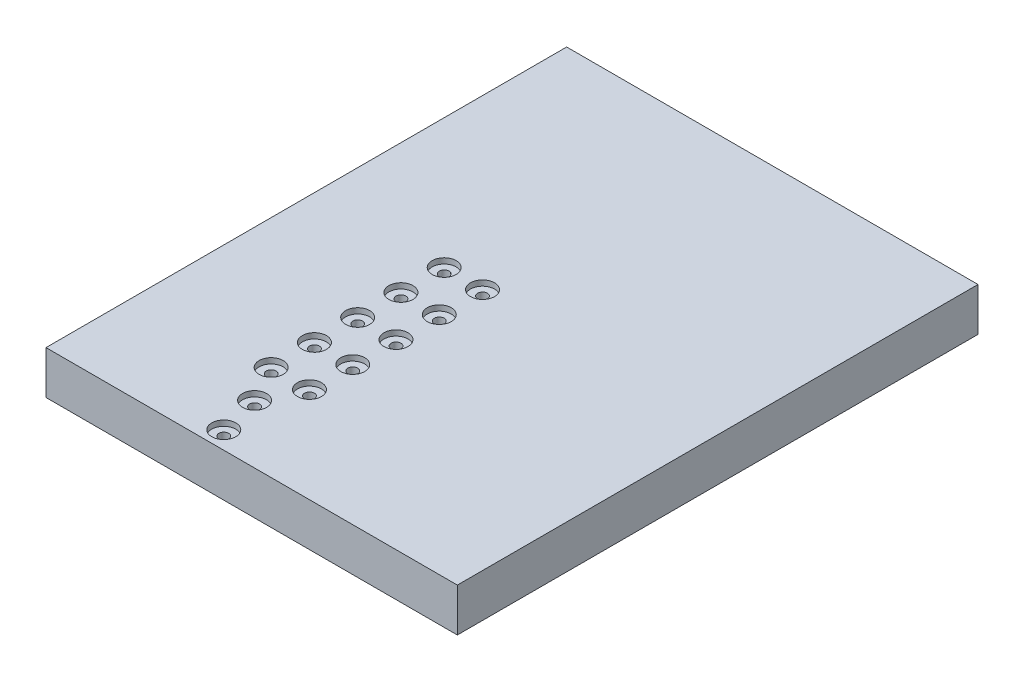
ISO-10303-21;
HEADER;
FILE_DESCRIPTION(('STEP AP214'),'2;1');
FILE_NAME('part.step','',(''),(''),'','','');
FILE_SCHEMA(('AUTOMOTIVE_DESIGN { 1 0 10303 214 1 1 1 1 }'));
ENDSEC;
DATA;
#1=APPLICATION_CONTEXT('core data for automotive mechanical design processes');
#2=APPLICATION_PROTOCOL_DEFINITION('international standard','automotive_design',2000,#1);
#3=PRODUCT_CONTEXT('',#1,'mechanical');
#4=PRODUCT('Part','Part','',(#3));
#5=PRODUCT_RELATED_PRODUCT_CATEGORY('part','',(#4));
#6=PRODUCT_DEFINITION_FORMATION('','',#4);
#7=PRODUCT_DEFINITION_CONTEXT('part definition',#1,'design');
#8=PRODUCT_DEFINITION('design','',#6,#7);
#9=PRODUCT_DEFINITION_SHAPE('','',#8);
#10=(LENGTH_UNIT() NAMED_UNIT(*) SI_UNIT(.MILLI.,.METRE.));
#11=(NAMED_UNIT(*) PLANE_ANGLE_UNIT() SI_UNIT($,.RADIAN.));
#12=(NAMED_UNIT(*) SI_UNIT($,.STERADIAN.) SOLID_ANGLE_UNIT());
#13=UNCERTAINTY_MEASURE_WITH_UNIT(LENGTH_MEASURE(1.E-05),#10,'distance_accuracy_value','');
#14=(GEOMETRIC_REPRESENTATION_CONTEXT(3) GLOBAL_UNCERTAINTY_ASSIGNED_CONTEXT((#13)) GLOBAL_UNIT_ASSIGNED_CONTEXT((#10,
#11,#12)) REPRESENTATION_CONTEXT('',''));
#15=CARTESIAN_POINT('',(0.,0.,0.));
#16=DIRECTION('',(0.,0.,1.));
#17=DIRECTION('',(1.,0.,0.));
#18=AXIS2_PLACEMENT_3D('',#15,#16,#17);
#19=CARTESIAN_POINT('',(-4.42996892579231,10.,21.8648993809643));
#20=DIRECTION('',(0.,1.,0.));
#21=DIRECTION('',(0.,0.,1.));
#22=AXIS2_PLACEMENT_3D('',#19,#20,#21);
#23=CYLINDRICAL_SURFACE('',#22,2.77876);
#24=CARTESIAN_POINT('',(-4.42996892579231,8.73,21.8648993809643));
#25=DIRECTION('',(0.,1.,0.));
#26=DIRECTION('',(0.,0.,1.));
#27=AXIS2_PLACEMENT_3D('',#24,#25,#26);
#28=CIRCLE('',#27,2.77876);
#29=CARTESIAN_POINT('',(-4.42996892579231,8.73,24.6436593809643));
#30=VERTEX_POINT('',#29);
#31=EDGE_CURVE('E11',#30,#30,#28,.T.);
#32=ORIENTED_EDGE('',*,*,#31,.F.);
#33=EDGE_LOOP('',(#32));
#34=FACE_BOUND('',#33,.T.);
#35=CARTESIAN_POINT('',(-4.42996892579231,10.,21.8648993809643));
#36=DIRECTION('',(0.,1.,0.));
#37=DIRECTION('',(0.,0.,1.));
#38=AXIS2_PLACEMENT_3D('',#35,#36,#37);
#39=CIRCLE('',#38,2.77875999999999);
#40=CARTESIAN_POINT('',(-4.42996892579231,10.,24.6436593809643));
#41=VERTEX_POINT('',#40);
#42=EDGE_CURVE('E268',#41,#41,#39,.T.);
#43=ORIENTED_EDGE('',*,*,#42,.T.);
#44=EDGE_LOOP('',(#43));
#45=FACE_BOUND('',#44,.T.);
#46=ADVANCED_FACE('F33',(#34,#45),#23,.F.);
#47=CARTESIAN_POINT('',(-3.29966892579231,8.73,21.8648993809643));
#48=DIRECTION('',(0.,-1.,0.));
#49=DIRECTION('',(0.,0.,-1.));
#50=AXIS2_PLACEMENT_3D('',#47,#48,#49);
#51=PLANE('',#50);
#52=CARTESIAN_POINT('',(-4.42996892579231,8.73,21.8648993809643));
#53=DIRECTION('',(0.,1.,0.));
#54=DIRECTION('',(0.,0.,1.));
#55=AXIS2_PLACEMENT_3D('',#52,#53,#54);
#56=CIRCLE('',#55,1.1303);
#57=CARTESIAN_POINT('',(-4.42996892579231,8.73,22.9951993809643));
#58=VERTEX_POINT('',#57);
#59=EDGE_CURVE('E40',#58,#58,#56,.T.);
#60=ORIENTED_EDGE('',*,*,#59,.F.);
#61=EDGE_LOOP('',(#60));
#62=FACE_BOUND('',#61,.T.);
#63=ORIENTED_EDGE('',*,*,#31,.T.);
#64=EDGE_LOOP('',(#63));
#65=FACE_BOUND('',#64,.T.);
#66=ADVANCED_FACE('F278',(#62,#65),#51,.F.);
#67=CARTESIAN_POINT('',(-4.42996892579231,10.,21.8648993809643));
#68=DIRECTION('',(0.,1.,0.));
#69=DIRECTION('',(0.,0.,1.));
#70=AXIS2_PLACEMENT_3D('',#67,#68,#69);
#71=CYLINDRICAL_SURFACE('',#70,1.1303);
#72=CARTESIAN_POINT('',(-4.42996892579231,7.,21.8648993809643));
#73=DIRECTION('',(0.,1.,0.));
#74=DIRECTION('',(0.,0.,1.));
#75=AXIS2_PLACEMENT_3D('',#72,#73,#74);
#76=CIRCLE('',#75,1.1303);
#77=CARTESIAN_POINT('',(-4.42996892579231,7.,22.9951993809643));
#78=VERTEX_POINT('',#77);
#79=EDGE_CURVE('E271',#78,#78,#76,.T.);
#80=ORIENTED_EDGE('',*,*,#79,.F.);
#81=EDGE_LOOP('',(#80));
#82=FACE_BOUND('',#81,.T.);
#83=ORIENTED_EDGE('',*,*,#59,.T.);
#84=EDGE_LOOP('',(#83));
#85=FACE_BOUND('',#84,.T.);
#86=ADVANCED_FACE('F276',(#82,#85),#71,.F.);
#87=CARTESIAN_POINT('',(-4.42996892579231,7.,21.8648993809643));
#88=DIRECTION('',(0.,1.,0.));
#89=DIRECTION('',(0.,0.,1.));
#90=AXIS2_PLACEMENT_3D('',#87,#88,#89);
#91=CONICAL_SURFACE('',#90,1.1303,1.02974425867665);
#92=CARTESIAN_POINT('',(-4.42996892579231,6.32084724231315,21.8648993809643));
#93=VERTEX_POINT('',#92);
#94=VERTEX_LOOP('',#93);
#95=FACE_BOUND('',#94,.T.);
#96=ORIENTED_EDGE('',*,*,#79,.T.);
#97=EDGE_LOOP('',(#96));
#98=FACE_BOUND('',#97,.T.);
#99=ADVANCED_FACE('F349',(#95,#98),#91,.F.);
#100=CARTESIAN_POINT('',(-4.42996892579231,10.,31.8648993809643));
#101=DIRECTION('',(0.,1.,0.));
#102=DIRECTION('',(0.,0.,1.));
#103=AXIS2_PLACEMENT_3D('',#100,#101,#102);
#104=CYLINDRICAL_SURFACE('',#103,2.77876);
#105=CARTESIAN_POINT('',(-4.42996892579231,8.73,31.8648993809643));
#106=DIRECTION('',(0.,1.,0.));
#107=DIRECTION('',(0.,0.,1.));
#108=AXIS2_PLACEMENT_3D('',#105,#106,#107);
#109=CIRCLE('',#108,2.77876);
#110=CARTESIAN_POINT('',(-4.42996892579231,8.73,34.6436593809643));
#111=VERTEX_POINT('',#110);
#112=EDGE_CURVE('E265',#111,#111,#109,.T.);
#113=ORIENTED_EDGE('',*,*,#112,.F.);
#114=EDGE_LOOP('',(#113));
#115=FACE_BOUND('',#114,.T.);
#116=CARTESIAN_POINT('',(-4.42996892579231,10.,31.8648993809643));
#117=DIRECTION('',(0.,1.,0.));
#118=DIRECTION('',(0.,0.,1.));
#119=AXIS2_PLACEMENT_3D('',#116,#117,#118);
#120=CIRCLE('',#119,2.77875999999999);
#121=CARTESIAN_POINT('',(-4.42996892579231,10.,34.6436593809643));
#122=VERTEX_POINT('',#121);
#123=EDGE_CURVE('E256',#122,#122,#120,.T.);
#124=ORIENTED_EDGE('',*,*,#123,.T.);
#125=EDGE_LOOP('',(#124));
#126=FACE_BOUND('',#125,.T.);
#127=ADVANCED_FACE('F345',(#115,#126),#104,.F.);
#128=CARTESIAN_POINT('',(-3.29966892579231,8.73,31.8648993809643));
#129=DIRECTION('',(0.,-1.,0.));
#130=DIRECTION('',(0.,0.,-1.));
#131=AXIS2_PLACEMENT_3D('',#128,#129,#130);
#132=PLANE('',#131);
#133=CARTESIAN_POINT('',(-4.42996892579231,8.73,31.8648993809643));
#134=DIRECTION('',(0.,1.,0.));
#135=DIRECTION('',(0.,0.,1.));
#136=AXIS2_PLACEMENT_3D('',#133,#134,#135);
#137=CIRCLE('',#136,1.1303);
#138=CARTESIAN_POINT('',(-4.42996892579231,8.73,32.9951993809643));
#139=VERTEX_POINT('',#138);
#140=EDGE_CURVE('E262',#139,#139,#137,.T.);
#141=ORIENTED_EDGE('',*,*,#140,.F.);
#142=EDGE_LOOP('',(#141));
#143=FACE_BOUND('',#142,.T.);
#144=ORIENTED_EDGE('',*,*,#112,.T.);
#145=EDGE_LOOP('',(#144));
#146=FACE_BOUND('',#145,.T.);
#147=ADVANCED_FACE('F341',(#143,#146),#132,.F.);
#148=CARTESIAN_POINT('',(-4.42996892579231,10.,31.8648993809643));
#149=DIRECTION('',(0.,1.,0.));
#150=DIRECTION('',(0.,0.,1.));
#151=AXIS2_PLACEMENT_3D('',#148,#149,#150);
#152=CYLINDRICAL_SURFACE('',#151,1.1303);
#153=CARTESIAN_POINT('',(-4.42996892579231,7.,31.8648993809643));
#154=DIRECTION('',(0.,1.,0.));
#155=DIRECTION('',(0.,0.,1.));
#156=AXIS2_PLACEMENT_3D('',#153,#154,#155);
#157=CIRCLE('',#156,1.1303);
#158=CARTESIAN_POINT('',(-4.42996892579231,7.,32.9951993809643));
#159=VERTEX_POINT('',#158);
#160=EDGE_CURVE('E259',#159,#159,#157,.T.);
#161=ORIENTED_EDGE('',*,*,#160,.F.);
#162=EDGE_LOOP('',(#161));
#163=FACE_BOUND('',#162,.T.);
#164=ORIENTED_EDGE('',*,*,#140,.T.);
#165=EDGE_LOOP('',(#164));
#166=FACE_BOUND('',#165,.T.);
#167=ADVANCED_FACE('F338',(#163,#166),#152,.F.);
#168=CARTESIAN_POINT('',(-4.42996892579231,7.,31.8648993809643));
#169=DIRECTION('',(0.,1.,0.));
#170=DIRECTION('',(0.,0.,1.));
#171=AXIS2_PLACEMENT_3D('',#168,#169,#170);
#172=CONICAL_SURFACE('',#171,1.1303,1.02974425867665);
#173=CARTESIAN_POINT('',(-4.42996892579231,6.32084724231315,31.8648993809643));
#174=VERTEX_POINT('',#173);
#175=VERTEX_LOOP('',#174);
#176=FACE_BOUND('',#175,.T.);
#177=ORIENTED_EDGE('',*,*,#160,.T.);
#178=EDGE_LOOP('',(#177));
#179=FACE_BOUND('',#178,.T.);
#180=ADVANCED_FACE('F334',(#176,#179),#172,.F.);
#181=CARTESIAN_POINT('',(-4.42996892579231,10.,41.8648993809643));
#182=DIRECTION('',(0.,1.,0.));
#183=DIRECTION('',(0.,0.,1.));
#184=AXIS2_PLACEMENT_3D('',#181,#182,#183);
#185=CYLINDRICAL_SURFACE('',#184,2.77876);
#186=CARTESIAN_POINT('',(-4.42996892579231,8.73,41.8648993809643));
#187=DIRECTION('',(0.,1.,0.));
#188=DIRECTION('',(0.,0.,1.));
#189=AXIS2_PLACEMENT_3D('',#186,#187,#188);
#190=CIRCLE('',#189,2.77876);
#191=CARTESIAN_POINT('',(-4.42996892579231,8.73,44.6436593809643));
#192=VERTEX_POINT('',#191);
#193=EDGE_CURVE('E253',#192,#192,#190,.T.);
#194=ORIENTED_EDGE('',*,*,#193,.F.);
#195=EDGE_LOOP('',(#194));
#196=FACE_BOUND('',#195,.T.);
#197=CARTESIAN_POINT('',(-4.42996892579231,10.,41.8648993809643));
#198=DIRECTION('',(0.,1.,0.));
#199=DIRECTION('',(0.,0.,1.));
#200=AXIS2_PLACEMENT_3D('',#197,#198,#199);
#201=CIRCLE('',#200,2.77875999999999);
#202=CARTESIAN_POINT('',(-4.42996892579231,10.,44.6436593809643));
#203=VERTEX_POINT('',#202);
#204=EDGE_CURVE('E244',#203,#203,#201,.T.);
#205=ORIENTED_EDGE('',*,*,#204,.T.);
#206=EDGE_LOOP('',(#205));
#207=FACE_BOUND('',#206,.T.);
#208=ADVANCED_FACE('F330',(#196,#207),#185,.F.);
#209=CARTESIAN_POINT('',(-3.29966892579231,8.73,41.8648993809643));
#210=DIRECTION('',(0.,-1.,0.));
#211=DIRECTION('',(0.,0.,-1.));
#212=AXIS2_PLACEMENT_3D('',#209,#210,#211);
#213=PLANE('',#212);
#214=CARTESIAN_POINT('',(-4.42996892579231,8.73,41.8648993809643));
#215=DIRECTION('',(0.,1.,0.));
#216=DIRECTION('',(0.,0.,1.));
#217=AXIS2_PLACEMENT_3D('',#214,#215,#216);
#218=CIRCLE('',#217,1.1303);
#219=CARTESIAN_POINT('',(-4.42996892579231,8.73,42.9951993809643));
#220=VERTEX_POINT('',#219);
#221=EDGE_CURVE('E250',#220,#220,#218,.T.);
#222=ORIENTED_EDGE('',*,*,#221,.F.);
#223=EDGE_LOOP('',(#222));
#224=FACE_BOUND('',#223,.T.);
#225=ORIENTED_EDGE('',*,*,#193,.T.);
#226=EDGE_LOOP('',(#225));
#227=FACE_BOUND('',#226,.T.);
#228=ADVANCED_FACE('F326',(#224,#227),#213,.F.);
#229=CARTESIAN_POINT('',(-4.42996892579231,10.,41.8648993809643));
#230=DIRECTION('',(0.,1.,0.));
#231=DIRECTION('',(0.,0.,1.));
#232=AXIS2_PLACEMENT_3D('',#229,#230,#231);
#233=CYLINDRICAL_SURFACE('',#232,1.1303);
#234=CARTESIAN_POINT('',(-4.42996892579231,7.,41.8648993809643));
#235=DIRECTION('',(0.,1.,0.));
#236=DIRECTION('',(0.,0.,1.));
#237=AXIS2_PLACEMENT_3D('',#234,#235,#236);
#238=CIRCLE('',#237,1.1303);
#239=CARTESIAN_POINT('',(-4.42996892579231,7.,42.9951993809643));
#240=VERTEX_POINT('',#239);
#241=EDGE_CURVE('E247',#240,#240,#238,.T.);
#242=ORIENTED_EDGE('',*,*,#241,.F.);
#243=EDGE_LOOP('',(#242));
#244=FACE_BOUND('',#243,.T.);
#245=ORIENTED_EDGE('',*,*,#221,.T.);
#246=EDGE_LOOP('',(#245));
#247=FACE_BOUND('',#246,.T.);
#248=ADVANCED_FACE('F322',(#244,#247),#233,.F.);
#249=CARTESIAN_POINT('',(-4.42996892579231,7.,41.8648993809643));
#250=DIRECTION('',(0.,1.,0.));
#251=DIRECTION('',(0.,0.,1.));
#252=AXIS2_PLACEMENT_3D('',#249,#250,#251);
#253=CONICAL_SURFACE('',#252,1.1303,1.02974425867665);
#254=CARTESIAN_POINT('',(-4.42996892579231,6.32084724231315,41.8648993809643));
#255=VERTEX_POINT('',#254);
#256=VERTEX_LOOP('',#255);
#257=FACE_BOUND('',#256,.T.);
#258=ORIENTED_EDGE('',*,*,#241,.T.);
#259=EDGE_LOOP('',(#258));
#260=FACE_BOUND('',#259,.T.);
#261=ADVANCED_FACE('F318',(#257,#260),#253,.F.);
#262=CARTESIAN_POINT('',(-34.4299689257923,10.,-36.441967666633));
#263=DIRECTION('',(1.,0.,0.));
#264=DIRECTION('',(0.,0.,-1.));
#265=AXIS2_PLACEMENT_3D('',#262,#263,#264);
#266=PLANE('',#265);
#267=DIRECTION('',(0.,0.,1.));
#268=VECTOR('',#267,1.);
#269=CARTESIAN_POINT('',(-34.4299689257923,0.,-36.441967666633));
#270=LINE('',#269,#268);
#271=CARTESIAN_POINT('',(-34.4299689257923,0.,-36.441967666633));
#272=VERTEX_POINT('',#271);
#273=CARTESIAN_POINT('',(-34.4299689257923,0.,83.9112685961254));
#274=VERTEX_POINT('',#273);
#275=EDGE_CURVE('E214',#272,#274,#270,.T.);
#276=ORIENTED_EDGE('',*,*,#275,.T.);
#277=DIRECTION('',(0.,-1.,0.));
#278=VECTOR('',#277,1.);
#279=CARTESIAN_POINT('',(-34.4299689257923,10.,83.9112685961254));
#280=LINE('',#279,#278);
#281=CARTESIAN_POINT('',(-34.4299689257923,10.,83.9112685961254));
#282=VERTEX_POINT('',#281);
#283=EDGE_CURVE('E241',#282,#274,#280,.T.);
#284=ORIENTED_EDGE('',*,*,#283,.F.);
#285=DIRECTION('',(0.,0.,1.));
#286=VECTOR('',#285,1.);
#287=CARTESIAN_POINT('',(-34.4299689257923,10.,-36.441967666633));
#288=LINE('',#287,#286);
#289=CARTESIAN_POINT('',(-34.4299689257923,10.,-36.441967666633));
#290=VERTEX_POINT('',#289);
#291=EDGE_CURVE('E215',#290,#282,#288,.T.);
#292=ORIENTED_EDGE('',*,*,#291,.F.);
#293=DIRECTION('',(0.,-1.,0.));
#294=VECTOR('',#293,1.);
#295=CARTESIAN_POINT('',(-34.4299689257923,10.,-36.441967666633));
#296=LINE('',#295,#294);
#297=EDGE_CURVE('E225',#290,#272,#296,.T.);
#298=ORIENTED_EDGE('',*,*,#297,.T.);
#299=EDGE_LOOP('',(#276,#284,#292,#298));
#300=FACE_BOUND('',#299,.T.);
#301=ADVANCED_FACE('F314',(#300),#266,.F.);
#302=CARTESIAN_POINT('',(-34.4299689257923,10.,83.9112685961254));
#303=DIRECTION('',(0.,0.,-1.));
#304=DIRECTION('',(-1.,0.,0.));
#305=AXIS2_PLACEMENT_3D('',#302,#303,#304);
#306=PLANE('',#305);
#307=DIRECTION('',(1.,0.,0.));
#308=VECTOR('',#307,1.);
#309=CARTESIAN_POINT('',(-34.4299689257923,0.,83.9112685961254));
#310=LINE('',#309,#308);
#311=CARTESIAN_POINT('',(60.6545776224721,0.,83.9112685961254));
#312=VERTEX_POINT('',#311);
#313=EDGE_CURVE('E228',#274,#312,#310,.T.);
#314=ORIENTED_EDGE('',*,*,#313,.T.);
#315=DIRECTION('',(0.,-1.,0.));
#316=VECTOR('',#315,1.);
#317=CARTESIAN_POINT('',(60.6545776224721,10.,83.9112685961254));
#318=LINE('',#317,#316);
#319=CARTESIAN_POINT('',(60.6545776224721,10.,83.9112685961254));
#320=VERTEX_POINT('',#319);
#321=EDGE_CURVE('E238',#320,#312,#318,.T.);
#322=ORIENTED_EDGE('',*,*,#321,.F.);
#323=DIRECTION('',(1.,0.,0.));
#324=VECTOR('',#323,1.);
#325=CARTESIAN_POINT('',(-34.4299689257923,10.,83.9112685961254));
#326=LINE('',#325,#324);
#327=EDGE_CURVE('E218',#282,#320,#326,.T.);
#328=ORIENTED_EDGE('',*,*,#327,.F.);
#329=ORIENTED_EDGE('',*,*,#283,.T.);
#330=EDGE_LOOP('',(#314,#322,#328,#329));
#331=FACE_BOUND('',#330,.T.);
#332=ADVANCED_FACE('F310',(#331),#306,.F.);
#333=CARTESIAN_POINT('',(60.6545776224721,10.,-36.441967666633));
#334=DIRECTION('',(-1.,0.,0.));
#335=DIRECTION('',(0.,0.,1.));
#336=AXIS2_PLACEMENT_3D('',#333,#334,#335);
#337=PLANE('',#336);
#338=DIRECTION('',(0.,0.,-1.));
#339=VECTOR('',#338,1.);
#340=CARTESIAN_POINT('',(60.6545776224721,0.,-36.441967666633));
#341=LINE('',#340,#339);
#342=CARTESIAN_POINT('',(60.6545776224721,0.,-36.441967666633));
#343=VERTEX_POINT('',#342);
#344=EDGE_CURVE('E230',#312,#343,#341,.T.);
#345=ORIENTED_EDGE('',*,*,#344,.T.);
#346=DIRECTION('',(0.,-1.,0.));
#347=VECTOR('',#346,1.);
#348=CARTESIAN_POINT('',(60.6545776224721,10.,-36.441967666633));
#349=LINE('',#348,#347);
#350=CARTESIAN_POINT('',(60.6545776224721,10.,-36.441967666633));
#351=VERTEX_POINT('',#350);
#352=EDGE_CURVE('E235',#351,#343,#349,.T.);
#353=ORIENTED_EDGE('',*,*,#352,.F.);
#354=DIRECTION('',(0.,0.,-1.));
#355=VECTOR('',#354,1.);
#356=CARTESIAN_POINT('',(60.6545776224721,10.,-36.441967666633));
#357=LINE('',#356,#355);
#358=EDGE_CURVE('E221',#320,#351,#357,.T.);
#359=ORIENTED_EDGE('',*,*,#358,.F.);
#360=ORIENTED_EDGE('',*,*,#321,.T.);
#361=EDGE_LOOP('',(#345,#353,#359,#360));
#362=FACE_BOUND('',#361,.T.);
#363=ADVANCED_FACE('F300',(#362),#337,.F.);
#364=CARTESIAN_POINT('',(-34.4299689257923,10.,-36.441967666633));
#365=DIRECTION('',(0.,0.,1.));
#366=DIRECTION('',(1.,0.,0.));
#367=AXIS2_PLACEMENT_3D('',#364,#365,#366);
#368=PLANE('',#367);
#369=DIRECTION('',(-1.,0.,0.));
#370=VECTOR('',#369,1.);
#371=CARTESIAN_POINT('',(-34.4299689257923,0.,-36.441967666633));
#372=LINE('',#371,#370);
#373=EDGE_CURVE('E219',#343,#272,#372,.T.);
#374=ORIENTED_EDGE('',*,*,#373,.T.);
#375=ORIENTED_EDGE('',*,*,#297,.F.);
#376=DIRECTION('',(-1.,0.,0.));
#377=VECTOR('',#376,1.);
#378=CARTESIAN_POINT('',(-34.4299689257923,10.,-36.441967666633));
#379=LINE('',#378,#377);
#380=EDGE_CURVE('E223',#351,#290,#379,.T.);
#381=ORIENTED_EDGE('',*,*,#380,.F.);
#382=ORIENTED_EDGE('',*,*,#352,.T.);
#383=EDGE_LOOP('',(#374,#375,#381,#382));
#384=FACE_BOUND('',#383,.T.);
#385=ADVANCED_FACE('F290',(#384),#368,.F.);
#386=CARTESIAN_POINT('',(0.,10.,0.));
#387=DIRECTION('',(0.,1.,0.));
#388=DIRECTION('',(0.,0.,1.));
#389=AXIS2_PLACEMENT_3D('',#386,#387,#388);
#390=PLANE('',#389);
#391=CARTESIAN_POINT('',(4.42996892579231,10.,21.8648993809643));
#392=DIRECTION('',(0.,1.,0.));
#393=DIRECTION('',(0.,0.,1.));
#394=AXIS2_PLACEMENT_3D('',#391,#392,#393);
#395=CIRCLE('',#394,2.77875999999999);
#396=CARTESIAN_POINT('',(4.42996892579231,10.,24.6436593809643));
#397=VERTEX_POINT('',#396);
#398=EDGE_CURVE('E808',#397,#397,#395,.T.);
#399=ORIENTED_EDGE('',*,*,#398,.F.);
#400=EDGE_LOOP('',(#399));
#401=FACE_BOUND('',#400,.T.);
#402=CARTESIAN_POINT('',(4.42996892579231,10.,31.8648993809643));
#403=DIRECTION('',(0.,1.,0.));
#404=DIRECTION('',(0.,0.,1.));
#405=AXIS2_PLACEMENT_3D('',#402,#403,#404);
#406=CIRCLE('',#405,2.77875999999999);
#407=CARTESIAN_POINT('',(4.42996892579231,10.,34.6436593809643));
#408=VERTEX_POINT('',#407);
#409=EDGE_CURVE('E111',#408,#408,#406,.T.);
#410=ORIENTED_EDGE('',*,*,#409,.F.);
#411=EDGE_LOOP('',(#410));
#412=FACE_BOUND('',#411,.T.);
#413=CARTESIAN_POINT('',(4.42996892579231,10.,41.8648993809643));
#414=DIRECTION('',(0.,1.,0.));
#415=DIRECTION('',(0.,0.,1.));
#416=AXIS2_PLACEMENT_3D('',#413,#414,#415);
#417=CIRCLE('',#416,2.77875999999999);
#418=CARTESIAN_POINT('',(4.42996892579231,10.,44.6436593809643));
#419=VERTEX_POINT('',#418);
#420=EDGE_CURVE('E130',#419,#419,#417,.T.);
#421=ORIENTED_EDGE('',*,*,#420,.F.);
#422=EDGE_LOOP('',(#421));
#423=FACE_BOUND('',#422,.T.);
#424=CARTESIAN_POINT('',(4.42996892579231,10.,51.8648993809643));
#425=DIRECTION('',(0.,1.,0.));
#426=DIRECTION('',(0.,0.,1.));
#427=AXIS2_PLACEMENT_3D('',#424,#425,#426);
#428=CIRCLE('',#427,2.77875999999999);
#429=CARTESIAN_POINT('',(4.42996892579231,10.,54.6436593809643));
#430=VERTEX_POINT('',#429);
#431=EDGE_CURVE('E142',#430,#430,#428,.T.);
#432=ORIENTED_EDGE('',*,*,#431,.F.);
#433=EDGE_LOOP('',(#432));
#434=FACE_BOUND('',#433,.T.);
#435=CARTESIAN_POINT('',(4.42996892579231,10.,61.8648993809643));
#436=DIRECTION('',(0.,1.,0.));
#437=DIRECTION('',(0.,0.,1.));
#438=AXIS2_PLACEMENT_3D('',#435,#436,#437);
#439=CIRCLE('',#438,2.77875999999999);
#440=CARTESIAN_POINT('',(4.42996892579231,10.,64.6436593809643));
#441=VERTEX_POINT('',#440);
#442=EDGE_CURVE('E154',#441,#441,#439,.T.);
#443=ORIENTED_EDGE('',*,*,#442,.F.);
#444=EDGE_LOOP('',(#443));
#445=FACE_BOUND('',#444,.T.);
#446=CARTESIAN_POINT('',(2.57397779532142,10.,79.8185527945847));
#447=DIRECTION('',(0.,1.,0.));
#448=DIRECTION('',(0.,0.,1.));
#449=AXIS2_PLACEMENT_3D('',#446,#447,#448);
#450=CIRCLE('',#449,2.77875999999999);
#451=CARTESIAN_POINT('',(2.57397779532142,10.,82.5973127945847));
#452=VERTEX_POINT('',#451);
#453=EDGE_CURVE('E166',#452,#452,#450,.T.);
#454=ORIENTED_EDGE('',*,*,#453,.F.);
#455=EDGE_LOOP('',(#454));
#456=FACE_BOUND('',#455,.T.);
#457=CARTESIAN_POINT('',(0.253826091125352,10.,70.3806825483727));
#458=DIRECTION('',(0.,1.,0.));
#459=DIRECTION('',(0.,0.,1.));
#460=AXIS2_PLACEMENT_3D('',#457,#458,#459);
#461=CIRCLE('',#460,2.77875999999999);
#462=CARTESIAN_POINT('',(0.253826091125352,10.,73.1594425483727));
#463=VERTEX_POINT('',#462);
#464=EDGE_CURVE('E178',#463,#463,#461,.T.);
#465=ORIENTED_EDGE('',*,*,#464,.F.);
#466=EDGE_LOOP('',(#465));
#467=FACE_BOUND('',#466,.T.);
#468=CARTESIAN_POINT('',(-4.42996892579231,10.,51.8648993809643));
#469=DIRECTION('',(0.,1.,0.));
#470=DIRECTION('',(0.,0.,1.));
#471=AXIS2_PLACEMENT_3D('',#468,#469,#470);
#472=CIRCLE('',#471,2.77875999999999);
#473=CARTESIAN_POINT('',(-4.42996892579231,10.,54.6436593809643));
#474=VERTEX_POINT('',#473);
#475=EDGE_CURVE('E190',#474,#474,#472,.T.);
#476=ORIENTED_EDGE('',*,*,#475,.F.);
#477=EDGE_LOOP('',(#476));
#478=FACE_BOUND('',#477,.T.);
#479=CARTESIAN_POINT('',(-4.42996892579231,10.,61.8648993809643));
#480=DIRECTION('',(0.,1.,0.));
#481=DIRECTION('',(0.,0.,1.));
#482=AXIS2_PLACEMENT_3D('',#479,#480,#481);
#483=CIRCLE('',#482,2.77875999999999);
#484=CARTESIAN_POINT('',(-4.42996892579231,10.,64.6436593809643));
#485=VERTEX_POINT('',#484);
#486=EDGE_CURVE('E202',#485,#485,#483,.T.);
#487=ORIENTED_EDGE('',*,*,#486,.F.);
#488=EDGE_LOOP('',(#487));
#489=FACE_BOUND('',#488,.T.);
#490=ORIENTED_EDGE('',*,*,#291,.T.);
#491=ORIENTED_EDGE('',*,*,#327,.T.);
#492=ORIENTED_EDGE('',*,*,#358,.T.);
#493=ORIENTED_EDGE('',*,*,#380,.T.);
#494=EDGE_LOOP('',(#490,#491,#492,#493));
#495=FACE_BOUND('',#494,.T.);
#496=ORIENTED_EDGE('',*,*,#204,.F.);
#497=EDGE_LOOP('',(#496));
#498=FACE_BOUND('',#497,.T.);
#499=ORIENTED_EDGE('',*,*,#123,.F.);
#500=EDGE_LOOP('',(#499));
#501=FACE_BOUND('',#500,.T.);
#502=ORIENTED_EDGE('',*,*,#42,.F.);
#503=EDGE_LOOP('',(#502));
#504=FACE_BOUND('',#503,.T.);
#505=ADVANCED_FACE('F287',(#401,#412,#423,#434,#445,#456,#467,#478,#489,#495,#498,#501,#504),
#390,.T.);
#506=CARTESIAN_POINT('',(0.,0.,0.));
#507=DIRECTION('',(0.,1.,0.));
#508=DIRECTION('',(0.,0.,1.));
#509=AXIS2_PLACEMENT_3D('',#506,#507,#508);
#510=PLANE('',#509);
#511=ORIENTED_EDGE('',*,*,#275,.F.);
#512=ORIENTED_EDGE('',*,*,#373,.F.);
#513=ORIENTED_EDGE('',*,*,#344,.F.);
#514=ORIENTED_EDGE('',*,*,#313,.F.);
#515=EDGE_LOOP('',(#511,#512,#513,#514));
#516=FACE_BOUND('',#515,.T.);
#517=ADVANCED_FACE('F289',(#516),#510,.F.);
#518=CARTESIAN_POINT('',(-4.42996892579231,7.,61.8648993809643));
#519=DIRECTION('',(0.,1.,0.));
#520=DIRECTION('',(0.,0.,1.));
#521=AXIS2_PLACEMENT_3D('',#518,#519,#520);
#522=CONICAL_SURFACE('',#521,1.1303,1.02974425867665);
#523=CARTESIAN_POINT('',(-4.42996892579231,6.32084724231315,61.8648993809643));
#524=VERTEX_POINT('',#523);
#525=VERTEX_LOOP('',#524);
#526=FACE_BOUND('',#525,.T.);
#527=CARTESIAN_POINT('',(-4.42996892579231,7.,61.8648993809643));
#528=DIRECTION('',(0.,1.,0.));
#529=DIRECTION('',(0.,0.,1.));
#530=AXIS2_PLACEMENT_3D('',#527,#528,#529);
#531=CIRCLE('',#530,1.1303);
#532=CARTESIAN_POINT('',(-4.42996892579231,7.,62.9951993809643));
#533=VERTEX_POINT('',#532);
#534=EDGE_CURVE('E211',#533,#533,#531,.T.);
#535=ORIENTED_EDGE('',*,*,#534,.T.);
#536=EDGE_LOOP('',(#535));
#537=FACE_BOUND('',#536,.T.);
#538=ADVANCED_FACE('F297',(#526,#537),#522,.F.);
#539=CARTESIAN_POINT('',(-4.42996892579231,10.,61.8648993809643));
#540=DIRECTION('',(0.,1.,0.));
#541=DIRECTION('',(0.,0.,1.));
#542=AXIS2_PLACEMENT_3D('',#539,#540,#541);
#543=CYLINDRICAL_SURFACE('',#542,1.1303);
#544=ORIENTED_EDGE('',*,*,#534,.F.);
#545=EDGE_LOOP('',(#544));
#546=FACE_BOUND('',#545,.T.);
#547=CARTESIAN_POINT('',(-4.42996892579231,8.73,61.8648993809643));
#548=DIRECTION('',(0.,1.,0.));
#549=DIRECTION('',(0.,0.,1.));
#550=AXIS2_PLACEMENT_3D('',#547,#548,#549);
#551=CIRCLE('',#550,1.1303);
#552=CARTESIAN_POINT('',(-4.42996892579231,8.73,62.9951993809643));
#553=VERTEX_POINT('',#552);
#554=EDGE_CURVE('E208',#553,#553,#551,.T.);
#555=ORIENTED_EDGE('',*,*,#554,.T.);
#556=EDGE_LOOP('',(#555));
#557=FACE_BOUND('',#556,.T.);
#558=ADVANCED_FACE('F430',(#546,#557),#543,.F.);
#559=CARTESIAN_POINT('',(-3.29966892579231,8.73,61.8648993809643));
#560=DIRECTION('',(0.,-1.,0.));
#561=DIRECTION('',(0.,0.,-1.));
#562=AXIS2_PLACEMENT_3D('',#559,#560,#561);
#563=PLANE('',#562);
#564=ORIENTED_EDGE('',*,*,#554,.F.);
#565=EDGE_LOOP('',(#564));
#566=FACE_BOUND('',#565,.T.);
#567=CARTESIAN_POINT('',(-4.42996892579231,8.73,61.8648993809643));
#568=DIRECTION('',(0.,1.,0.));
#569=DIRECTION('',(0.,0.,1.));
#570=AXIS2_PLACEMENT_3D('',#567,#568,#569);
#571=CIRCLE('',#570,2.77876);
#572=CARTESIAN_POINT('',(-4.42996892579231,8.73,64.6436593809643));
#573=VERTEX_POINT('',#572);
#574=EDGE_CURVE('E205',#573,#573,#571,.T.);
#575=ORIENTED_EDGE('',*,*,#574,.T.);
#576=EDGE_LOOP('',(#575));
#577=FACE_BOUND('',#576,.T.);
#578=ADVANCED_FACE('F439',(#566,#577),#563,.F.);
#579=CARTESIAN_POINT('',(-4.42996892579231,10.,61.8648993809643));
#580=DIRECTION('',(0.,1.,0.));
#581=DIRECTION('',(0.,0.,1.));
#582=AXIS2_PLACEMENT_3D('',#579,#580,#581);
#583=CYLINDRICAL_SURFACE('',#582,2.77876);
#584=ORIENTED_EDGE('',*,*,#574,.F.);
#585=EDGE_LOOP('',(#584));
#586=FACE_BOUND('',#585,.T.);
#587=ORIENTED_EDGE('',*,*,#486,.T.);
#588=EDGE_LOOP('',(#587));
#589=FACE_BOUND('',#588,.T.);
#590=ADVANCED_FACE('F448',(#586,#589),#583,.F.);
#591=CARTESIAN_POINT('',(-4.42996892579231,7.,51.8648993809643));
#592=DIRECTION('',(0.,1.,0.));
#593=DIRECTION('',(0.,0.,1.));
#594=AXIS2_PLACEMENT_3D('',#591,#592,#593);
#595=CONICAL_SURFACE('',#594,1.1303,1.02974425867665);
#596=CARTESIAN_POINT('',(-4.42996892579231,6.32084724231315,51.8648993809643));
#597=VERTEX_POINT('',#596);
#598=VERTEX_LOOP('',#597);
#599=FACE_BOUND('',#598,.T.);
#600=CARTESIAN_POINT('',(-4.42996892579231,7.,51.8648993809643));
#601=DIRECTION('',(0.,1.,0.));
#602=DIRECTION('',(0.,0.,1.));
#603=AXIS2_PLACEMENT_3D('',#600,#601,#602);
#604=CIRCLE('',#603,1.1303);
#605=CARTESIAN_POINT('',(-4.42996892579231,7.,52.9951993809643));
#606=VERTEX_POINT('',#605);
#607=EDGE_CURVE('E199',#606,#606,#604,.T.);
#608=ORIENTED_EDGE('',*,*,#607,.T.);
#609=EDGE_LOOP('',(#608));
#610=FACE_BOUND('',#609,.T.);
#611=ADVANCED_FACE('F458',(#599,#610),#595,.F.);
#612=CARTESIAN_POINT('',(-4.42996892579231,10.,51.8648993809643));
#613=DIRECTION('',(0.,1.,0.));
#614=DIRECTION('',(0.,0.,1.));
#615=AXIS2_PLACEMENT_3D('',#612,#613,#614);
#616=CYLINDRICAL_SURFACE('',#615,1.1303);
#617=ORIENTED_EDGE('',*,*,#607,.F.);
#618=EDGE_LOOP('',(#617));
#619=FACE_BOUND('',#618,.T.);
#620=CARTESIAN_POINT('',(-4.42996892579231,8.73,51.8648993809643));
#621=DIRECTION('',(0.,1.,0.));
#622=DIRECTION('',(0.,0.,1.));
#623=AXIS2_PLACEMENT_3D('',#620,#621,#622);
#624=CIRCLE('',#623,1.1303);
#625=CARTESIAN_POINT('',(-4.42996892579231,8.73,52.9951993809643));
#626=VERTEX_POINT('',#625);
#627=EDGE_CURVE('E196',#626,#626,#624,.T.);
#628=ORIENTED_EDGE('',*,*,#627,.T.);
#629=EDGE_LOOP('',(#628));
#630=FACE_BOUND('',#629,.T.);
#631=ADVANCED_FACE('F498',(#619,#630),#616,.F.);
#632=CARTESIAN_POINT('',(-3.29966892579231,8.73,51.8648993809643));
#633=DIRECTION('',(0.,-1.,0.));
#634=DIRECTION('',(0.,0.,-1.));
#635=AXIS2_PLACEMENT_3D('',#632,#633,#634);
#636=PLANE('',#635);
#637=ORIENTED_EDGE('',*,*,#627,.F.);
#638=EDGE_LOOP('',(#637));
#639=FACE_BOUND('',#638,.T.);
#640=CARTESIAN_POINT('',(-4.42996892579231,8.73,51.8648993809643));
#641=DIRECTION('',(0.,1.,0.));
#642=DIRECTION('',(0.,0.,1.));
#643=AXIS2_PLACEMENT_3D('',#640,#641,#642);
#644=CIRCLE('',#643,2.77876);
#645=CARTESIAN_POINT('',(-4.42996892579231,8.73,54.6436593809643));
#646=VERTEX_POINT('',#645);
#647=EDGE_CURVE('E193',#646,#646,#644,.T.);
#648=ORIENTED_EDGE('',*,*,#647,.T.);
#649=EDGE_LOOP('',(#648));
#650=FACE_BOUND('',#649,.T.);
#651=ADVANCED_FACE('F507',(#639,#650),#636,.F.);
#652=CARTESIAN_POINT('',(-4.42996892579231,10.,51.8648993809643));
#653=DIRECTION('',(0.,1.,0.));
#654=DIRECTION('',(0.,0.,1.));
#655=AXIS2_PLACEMENT_3D('',#652,#653,#654);
#656=CYLINDRICAL_SURFACE('',#655,2.77876);
#657=ORIENTED_EDGE('',*,*,#647,.F.);
#658=EDGE_LOOP('',(#657));
#659=FACE_BOUND('',#658,.T.);
#660=ORIENTED_EDGE('',*,*,#475,.T.);
#661=EDGE_LOOP('',(#660));
#662=FACE_BOUND('',#661,.T.);
#663=ADVANCED_FACE('F516',(#659,#662),#656,.F.);
#664=CARTESIAN_POINT('',(0.253826091125352,7.,70.3806825483727));
#665=DIRECTION('',(0.,1.,0.));
#666=DIRECTION('',(0.,0.,1.));
#667=AXIS2_PLACEMENT_3D('',#664,#665,#666);
#668=CONICAL_SURFACE('',#667,1.1303,1.02974425867665);
#669=CARTESIAN_POINT('',(0.253826091125352,6.32084724231315,70.3806825483727));
#670=VERTEX_POINT('',#669);
#671=VERTEX_LOOP('',#670);
#672=FACE_BOUND('',#671,.T.);
#673=CARTESIAN_POINT('',(0.253826091125352,7.,70.3806825483727));
#674=DIRECTION('',(0.,1.,0.));
#675=DIRECTION('',(0.,0.,1.));
#676=AXIS2_PLACEMENT_3D('',#673,#674,#675);
#677=CIRCLE('',#676,1.1303);
#678=CARTESIAN_POINT('',(0.253826091125352,7.,71.5109825483727));
#679=VERTEX_POINT('',#678);
#680=EDGE_CURVE('E187',#679,#679,#677,.T.);
#681=ORIENTED_EDGE('',*,*,#680,.T.);
#682=EDGE_LOOP('',(#681));
#683=FACE_BOUND('',#682,.T.);
#684=ADVANCED_FACE('F525',(#672,#683),#668,.F.);
#685=CARTESIAN_POINT('',(0.253826091125352,10.,70.3806825483727));
#686=DIRECTION('',(0.,1.,0.));
#687=DIRECTION('',(0.,0.,1.));
#688=AXIS2_PLACEMENT_3D('',#685,#686,#687);
#689=CYLINDRICAL_SURFACE('',#688,1.1303);
#690=ORIENTED_EDGE('',*,*,#680,.F.);
#691=EDGE_LOOP('',(#690));
#692=FACE_BOUND('',#691,.T.);
#693=CARTESIAN_POINT('',(0.253826091125352,8.73,70.3806825483727));
#694=DIRECTION('',(0.,1.,0.));
#695=DIRECTION('',(0.,0.,1.));
#696=AXIS2_PLACEMENT_3D('',#693,#694,#695);
#697=CIRCLE('',#696,1.1303);
#698=CARTESIAN_POINT('',(0.253826091125352,8.73,71.5109825483727));
#699=VERTEX_POINT('',#698);
#700=EDGE_CURVE('E184',#699,#699,#697,.T.);
#701=ORIENTED_EDGE('',*,*,#700,.T.);
#702=EDGE_LOOP('',(#701));
#703=FACE_BOUND('',#702,.T.);
#704=ADVANCED_FACE('F534',(#692,#703),#689,.F.);
#705=CARTESIAN_POINT('',(1.38412609112535,8.73,70.3806825483727));
#706=DIRECTION('',(0.,-1.,0.));
#707=DIRECTION('',(0.,0.,-1.));
#708=AXIS2_PLACEMENT_3D('',#705,#706,#707);
#709=PLANE('',#708);
#710=ORIENTED_EDGE('',*,*,#700,.F.);
#711=EDGE_LOOP('',(#710));
#712=FACE_BOUND('',#711,.T.);
#713=CARTESIAN_POINT('',(0.253826091125352,8.73,70.3806825483727));
#714=DIRECTION('',(0.,1.,0.));
#715=DIRECTION('',(0.,0.,1.));
#716=AXIS2_PLACEMENT_3D('',#713,#714,#715);
#717=CIRCLE('',#716,2.77876);
#718=CARTESIAN_POINT('',(0.253826091125352,8.73,73.1594425483727));
#719=VERTEX_POINT('',#718);
#720=EDGE_CURVE('E181',#719,#719,#717,.T.);
#721=ORIENTED_EDGE('',*,*,#720,.T.);
#722=EDGE_LOOP('',(#721));
#723=FACE_BOUND('',#722,.T.);
#724=ADVANCED_FACE('F543',(#712,#723),#709,.F.);
#725=CARTESIAN_POINT('',(0.253826091125352,10.,70.3806825483727));
#726=DIRECTION('',(0.,1.,0.));
#727=DIRECTION('',(0.,0.,1.));
#728=AXIS2_PLACEMENT_3D('',#725,#726,#727);
#729=CYLINDRICAL_SURFACE('',#728,2.77876);
#730=ORIENTED_EDGE('',*,*,#720,.F.);
#731=EDGE_LOOP('',(#730));
#732=FACE_BOUND('',#731,.T.);
#733=ORIENTED_EDGE('',*,*,#464,.T.);
#734=EDGE_LOOP('',(#733));
#735=FACE_BOUND('',#734,.T.);
#736=ADVANCED_FACE('F552',(#732,#735),#729,.F.);
#737=CARTESIAN_POINT('',(2.57397779532142,7.,79.8185527945847));
#738=DIRECTION('',(0.,1.,0.));
#739=DIRECTION('',(0.,0.,1.));
#740=AXIS2_PLACEMENT_3D('',#737,#738,#739);
#741=CONICAL_SURFACE('',#740,1.1303,1.02974425867665);
#742=CARTESIAN_POINT('',(2.57397779532142,6.32084724231315,79.8185527945847));
#743=VERTEX_POINT('',#742);
#744=VERTEX_LOOP('',#743);
#745=FACE_BOUND('',#744,.T.);
#746=CARTESIAN_POINT('',(2.57397779532142,7.,79.8185527945847));
#747=DIRECTION('',(0.,1.,0.));
#748=DIRECTION('',(0.,0.,1.));
#749=AXIS2_PLACEMENT_3D('',#746,#747,#748);
#750=CIRCLE('',#749,1.1303);
#751=CARTESIAN_POINT('',(2.57397779532142,7.,80.9488527945847));
#752=VERTEX_POINT('',#751);
#753=EDGE_CURVE('E175',#752,#752,#750,.T.);
#754=ORIENTED_EDGE('',*,*,#753,.T.);
#755=EDGE_LOOP('',(#754));
#756=FACE_BOUND('',#755,.T.);
#757=ADVANCED_FACE('F561',(#745,#756),#741,.F.);
#758=CARTESIAN_POINT('',(2.57397779532142,10.,79.8185527945847));
#759=DIRECTION('',(0.,1.,0.));
#760=DIRECTION('',(0.,0.,1.));
#761=AXIS2_PLACEMENT_3D('',#758,#759,#760);
#762=CYLINDRICAL_SURFACE('',#761,1.1303);
#763=ORIENTED_EDGE('',*,*,#753,.F.);
#764=EDGE_LOOP('',(#763));
#765=FACE_BOUND('',#764,.T.);
#766=CARTESIAN_POINT('',(2.57397779532142,8.73,79.8185527945847));
#767=DIRECTION('',(0.,1.,0.));
#768=DIRECTION('',(0.,0.,1.));
#769=AXIS2_PLACEMENT_3D('',#766,#767,#768);
#770=CIRCLE('',#769,1.1303);
#771=CARTESIAN_POINT('',(2.57397779532142,8.73,80.9488527945847));
#772=VERTEX_POINT('',#771);
#773=EDGE_CURVE('E172',#772,#772,#770,.T.);
#774=ORIENTED_EDGE('',*,*,#773,.T.);
#775=EDGE_LOOP('',(#774));
#776=FACE_BOUND('',#775,.T.);
#777=ADVANCED_FACE('F570',(#765,#776),#762,.F.);
#778=CARTESIAN_POINT('',(3.70427779532142,8.73,79.8185527945847));
#779=DIRECTION('',(0.,-1.,0.));
#780=DIRECTION('',(0.,0.,-1.));
#781=AXIS2_PLACEMENT_3D('',#778,#779,#780);
#782=PLANE('',#781);
#783=ORIENTED_EDGE('',*,*,#773,.F.);
#784=EDGE_LOOP('',(#783));
#785=FACE_BOUND('',#784,.T.);
#786=CARTESIAN_POINT('',(2.57397779532142,8.73,79.8185527945847));
#787=DIRECTION('',(0.,1.,0.));
#788=DIRECTION('',(0.,0.,1.));
#789=AXIS2_PLACEMENT_3D('',#786,#787,#788);
#790=CIRCLE('',#789,2.77876);
#791=CARTESIAN_POINT('',(2.57397779532142,8.73,82.5973127945847));
#792=VERTEX_POINT('',#791);
#793=EDGE_CURVE('E169',#792,#792,#790,.T.);
#794=ORIENTED_EDGE('',*,*,#793,.T.);
#795=EDGE_LOOP('',(#794));
#796=FACE_BOUND('',#795,.T.);
#797=ADVANCED_FACE('F579',(#785,#796),#782,.F.);
#798=CARTESIAN_POINT('',(2.57397779532142,10.,79.8185527945847));
#799=DIRECTION('',(0.,1.,0.));
#800=DIRECTION('',(0.,0.,1.));
#801=AXIS2_PLACEMENT_3D('',#798,#799,#800);
#802=CYLINDRICAL_SURFACE('',#801,2.77876);
#803=ORIENTED_EDGE('',*,*,#793,.F.);
#804=EDGE_LOOP('',(#803));
#805=FACE_BOUND('',#804,.T.);
#806=ORIENTED_EDGE('',*,*,#453,.T.);
#807=EDGE_LOOP('',(#806));
#808=FACE_BOUND('',#807,.T.);
#809=ADVANCED_FACE('F588',(#805,#808),#802,.F.);
#810=CARTESIAN_POINT('',(4.42996892579231,7.,61.8648993809643));
#811=DIRECTION('',(0.,1.,0.));
#812=DIRECTION('',(0.,0.,1.));
#813=AXIS2_PLACEMENT_3D('',#810,#811,#812);
#814=CONICAL_SURFACE('',#813,1.1303,1.02974425867665);
#815=CARTESIAN_POINT('',(4.42996892579231,6.32084724231315,61.8648993809643));
#816=VERTEX_POINT('',#815);
#817=VERTEX_LOOP('',#816);
#818=FACE_BOUND('',#817,.T.);
#819=CARTESIAN_POINT('',(4.42996892579231,7.,61.8648993809643));
#820=DIRECTION('',(0.,1.,0.));
#821=DIRECTION('',(0.,0.,1.));
#822=AXIS2_PLACEMENT_3D('',#819,#820,#821);
#823=CIRCLE('',#822,1.1303);
#824=CARTESIAN_POINT('',(4.42996892579231,7.,62.9951993809643));
#825=VERTEX_POINT('',#824);
#826=EDGE_CURVE('E163',#825,#825,#823,.T.);
#827=ORIENTED_EDGE('',*,*,#826,.T.);
#828=EDGE_LOOP('',(#827));
#829=FACE_BOUND('',#828,.T.);
#830=ADVANCED_FACE('F597',(#818,#829),#814,.F.);
#831=CARTESIAN_POINT('',(4.42996892579231,10.,61.8648993809643));
#832=DIRECTION('',(0.,1.,0.));
#833=DIRECTION('',(0.,0.,1.));
#834=AXIS2_PLACEMENT_3D('',#831,#832,#833);
#835=CYLINDRICAL_SURFACE('',#834,1.1303);
#836=ORIENTED_EDGE('',*,*,#826,.F.);
#837=EDGE_LOOP('',(#836));
#838=FACE_BOUND('',#837,.T.);
#839=CARTESIAN_POINT('',(4.42996892579231,8.73,61.8648993809643));
#840=DIRECTION('',(0.,1.,0.));
#841=DIRECTION('',(0.,0.,1.));
#842=AXIS2_PLACEMENT_3D('',#839,#840,#841);
#843=CIRCLE('',#842,1.1303);
#844=CARTESIAN_POINT('',(4.42996892579231,8.73,62.9951993809643));
#845=VERTEX_POINT('',#844);
#846=EDGE_CURVE('E160',#845,#845,#843,.T.);
#847=ORIENTED_EDGE('',*,*,#846,.T.);
#848=EDGE_LOOP('',(#847));
#849=FACE_BOUND('',#848,.T.);
#850=ADVANCED_FACE('F606',(#838,#849),#835,.F.);
#851=CARTESIAN_POINT('',(5.56026892579231,8.73,61.8648993809643));
#852=DIRECTION('',(0.,-1.,0.));
#853=DIRECTION('',(0.,0.,-1.));
#854=AXIS2_PLACEMENT_3D('',#851,#852,#853);
#855=PLANE('',#854);
#856=ORIENTED_EDGE('',*,*,#846,.F.);
#857=EDGE_LOOP('',(#856));
#858=FACE_BOUND('',#857,.T.);
#859=CARTESIAN_POINT('',(4.42996892579231,8.73,61.8648993809643));
#860=DIRECTION('',(0.,1.,0.));
#861=DIRECTION('',(0.,0.,1.));
#862=AXIS2_PLACEMENT_3D('',#859,#860,#861);
#863=CIRCLE('',#862,2.77876);
#864=CARTESIAN_POINT('',(4.42996892579231,8.73,64.6436593809643));
#865=VERTEX_POINT('',#864);
#866=EDGE_CURVE('E157',#865,#865,#863,.T.);
#867=ORIENTED_EDGE('',*,*,#866,.T.);
#868=EDGE_LOOP('',(#867));
#869=FACE_BOUND('',#868,.T.);
#870=ADVANCED_FACE('F615',(#858,#869),#855,.F.);
#871=CARTESIAN_POINT('',(4.42996892579231,10.,61.8648993809643));
#872=DIRECTION('',(0.,1.,0.));
#873=DIRECTION('',(0.,0.,1.));
#874=AXIS2_PLACEMENT_3D('',#871,#872,#873);
#875=CYLINDRICAL_SURFACE('',#874,2.77876);
#876=ORIENTED_EDGE('',*,*,#866,.F.);
#877=EDGE_LOOP('',(#876));
#878=FACE_BOUND('',#877,.T.);
#879=ORIENTED_EDGE('',*,*,#442,.T.);
#880=EDGE_LOOP('',(#879));
#881=FACE_BOUND('',#880,.T.);
#882=ADVANCED_FACE('F624',(#878,#881),#875,.F.);
#883=CARTESIAN_POINT('',(4.42996892579231,7.,51.8648993809643));
#884=DIRECTION('',(0.,1.,0.));
#885=DIRECTION('',(0.,0.,1.));
#886=AXIS2_PLACEMENT_3D('',#883,#884,#885);
#887=CONICAL_SURFACE('',#886,1.1303,1.02974425867665);
#888=CARTESIAN_POINT('',(4.42996892579231,6.32084724231315,51.8648993809643));
#889=VERTEX_POINT('',#888);
#890=VERTEX_LOOP('',#889);
#891=FACE_BOUND('',#890,.T.);
#892=CARTESIAN_POINT('',(4.42996892579231,7.,51.8648993809643));
#893=DIRECTION('',(0.,1.,0.));
#894=DIRECTION('',(0.,0.,1.));
#895=AXIS2_PLACEMENT_3D('',#892,#893,#894);
#896=CIRCLE('',#895,1.1303);
#897=CARTESIAN_POINT('',(4.42996892579231,7.,52.9951993809643));
#898=VERTEX_POINT('',#897);
#899=EDGE_CURVE('E151',#898,#898,#896,.T.);
#900=ORIENTED_EDGE('',*,*,#899,.T.);
#901=EDGE_LOOP('',(#900));
#902=FACE_BOUND('',#901,.T.);
#903=ADVANCED_FACE('F633',(#891,#902),#887,.F.);
#904=CARTESIAN_POINT('',(4.42996892579231,10.,51.8648993809643));
#905=DIRECTION('',(0.,1.,0.));
#906=DIRECTION('',(0.,0.,1.));
#907=AXIS2_PLACEMENT_3D('',#904,#905,#906);
#908=CYLINDRICAL_SURFACE('',#907,1.1303);
#909=ORIENTED_EDGE('',*,*,#899,.F.);
#910=EDGE_LOOP('',(#909));
#911=FACE_BOUND('',#910,.T.);
#912=CARTESIAN_POINT('',(4.42996892579231,8.73,51.8648993809643));
#913=DIRECTION('',(0.,1.,0.));
#914=DIRECTION('',(0.,0.,1.));
#915=AXIS2_PLACEMENT_3D('',#912,#913,#914);
#916=CIRCLE('',#915,1.1303);
#917=CARTESIAN_POINT('',(4.42996892579231,8.73,52.9951993809643));
#918=VERTEX_POINT('',#917);
#919=EDGE_CURVE('E148',#918,#918,#916,.T.);
#920=ORIENTED_EDGE('',*,*,#919,.T.);
#921=EDGE_LOOP('',(#920));
#922=FACE_BOUND('',#921,.T.);
#923=ADVANCED_FACE('F642',(#911,#922),#908,.F.);
#924=CARTESIAN_POINT('',(5.56026892579231,8.73,51.8648993809643));
#925=DIRECTION('',(0.,-1.,0.));
#926=DIRECTION('',(0.,0.,-1.));
#927=AXIS2_PLACEMENT_3D('',#924,#925,#926);
#928=PLANE('',#927);
#929=ORIENTED_EDGE('',*,*,#919,.F.);
#930=EDGE_LOOP('',(#929));
#931=FACE_BOUND('',#930,.T.);
#932=CARTESIAN_POINT('',(4.42996892579231,8.73,51.8648993809643));
#933=DIRECTION('',(0.,1.,0.));
#934=DIRECTION('',(0.,0.,1.));
#935=AXIS2_PLACEMENT_3D('',#932,#933,#934);
#936=CIRCLE('',#935,2.77876);
#937=CARTESIAN_POINT('',(4.42996892579231,8.73,54.6436593809643));
#938=VERTEX_POINT('',#937);
#939=EDGE_CURVE('E145',#938,#938,#936,.T.);
#940=ORIENTED_EDGE('',*,*,#939,.T.);
#941=EDGE_LOOP('',(#940));
#942=FACE_BOUND('',#941,.T.);
#943=ADVANCED_FACE('F651',(#931,#942),#928,.F.);
#944=CARTESIAN_POINT('',(4.42996892579231,10.,51.8648993809643));
#945=DIRECTION('',(0.,1.,0.));
#946=DIRECTION('',(0.,0.,1.));
#947=AXIS2_PLACEMENT_3D('',#944,#945,#946);
#948=CYLINDRICAL_SURFACE('',#947,2.77876);
#949=ORIENTED_EDGE('',*,*,#939,.F.);
#950=EDGE_LOOP('',(#949));
#951=FACE_BOUND('',#950,.T.);
#952=ORIENTED_EDGE('',*,*,#431,.T.);
#953=EDGE_LOOP('',(#952));
#954=FACE_BOUND('',#953,.T.);
#955=ADVANCED_FACE('F660',(#951,#954),#948,.F.);
#956=CARTESIAN_POINT('',(4.42996892579231,7.,41.8648993809643));
#957=DIRECTION('',(0.,1.,0.));
#958=DIRECTION('',(0.,0.,1.));
#959=AXIS2_PLACEMENT_3D('',#956,#957,#958);
#960=CONICAL_SURFACE('',#959,1.1303,1.02974425867665);
#961=CARTESIAN_POINT('',(4.42996892579231,6.32084724231315,41.8648993809643));
#962=VERTEX_POINT('',#961);
#963=VERTEX_LOOP('',#962);
#964=FACE_BOUND('',#963,.T.);
#965=CARTESIAN_POINT('',(4.42996892579231,7.,41.8648993809643));
#966=DIRECTION('',(0.,1.,0.));
#967=DIRECTION('',(0.,0.,1.));
#968=AXIS2_PLACEMENT_3D('',#965,#966,#967);
#969=CIRCLE('',#968,1.1303);
#970=CARTESIAN_POINT('',(4.42996892579231,7.,42.9951993809643));
#971=VERTEX_POINT('',#970);
#972=EDGE_CURVE('E139',#971,#971,#969,.T.);
#973=ORIENTED_EDGE('',*,*,#972,.T.);
#974=EDGE_LOOP('',(#973));
#975=FACE_BOUND('',#974,.T.);
#976=ADVANCED_FACE('F669',(#964,#975),#960,.F.);
#977=CARTESIAN_POINT('',(4.42996892579231,10.,41.8648993809643));
#978=DIRECTION('',(0.,1.,0.));
#979=DIRECTION('',(0.,0.,1.));
#980=AXIS2_PLACEMENT_3D('',#977,#978,#979);
#981=CYLINDRICAL_SURFACE('',#980,1.1303);
#982=ORIENTED_EDGE('',*,*,#972,.F.);
#983=EDGE_LOOP('',(#982));
#984=FACE_BOUND('',#983,.T.);
#985=CARTESIAN_POINT('',(4.42996892579231,8.73,41.8648993809643));
#986=DIRECTION('',(0.,1.,0.));
#987=DIRECTION('',(0.,0.,1.));
#988=AXIS2_PLACEMENT_3D('',#985,#986,#987);
#989=CIRCLE('',#988,1.1303);
#990=CARTESIAN_POINT('',(4.42996892579231,8.73,42.9951993809643));
#991=VERTEX_POINT('',#990);
#992=EDGE_CURVE('E136',#991,#991,#989,.T.);
#993=ORIENTED_EDGE('',*,*,#992,.T.);
#994=EDGE_LOOP('',(#993));
#995=FACE_BOUND('',#994,.T.);
#996=ADVANCED_FACE('F678',(#984,#995),#981,.F.);
#997=CARTESIAN_POINT('',(5.56026892579231,8.73,41.8648993809643));
#998=DIRECTION('',(0.,-1.,0.));
#999=DIRECTION('',(0.,0.,-1.));
#1000=AXIS2_PLACEMENT_3D('',#997,#998,#999);
#1001=PLANE('',#1000);
#1002=ORIENTED_EDGE('',*,*,#992,.F.);
#1003=EDGE_LOOP('',(#1002));
#1004=FACE_BOUND('',#1003,.T.);
#1005=CARTESIAN_POINT('',(4.42996892579231,8.73,41.8648993809643));
#1006=DIRECTION('',(0.,1.,0.));
#1007=DIRECTION('',(0.,0.,1.));
#1008=AXIS2_PLACEMENT_3D('',#1005,#1006,#1007);
#1009=CIRCLE('',#1008,2.77876);
#1010=CARTESIAN_POINT('',(4.42996892579231,8.73,44.6436593809643));
#1011=VERTEX_POINT('',#1010);
#1012=EDGE_CURVE('E133',#1011,#1011,#1009,.T.);
#1013=ORIENTED_EDGE('',*,*,#1012,.T.);
#1014=EDGE_LOOP('',(#1013));
#1015=FACE_BOUND('',#1014,.T.);
#1016=ADVANCED_FACE('F687',(#1004,#1015),#1001,.F.);
#1017=CARTESIAN_POINT('',(4.42996892579231,10.,41.8648993809643));
#1018=DIRECTION('',(0.,1.,0.));
#1019=DIRECTION('',(0.,0.,1.));
#1020=AXIS2_PLACEMENT_3D('',#1017,#1018,#1019);
#1021=CYLINDRICAL_SURFACE('',#1020,2.77876);
#1022=ORIENTED_EDGE('',*,*,#1012,.F.);
#1023=EDGE_LOOP('',(#1022));
#1024=FACE_BOUND('',#1023,.T.);
#1025=ORIENTED_EDGE('',*,*,#420,.T.);
#1026=EDGE_LOOP('',(#1025));
#1027=FACE_BOUND('',#1026,.T.);
#1028=ADVANCED_FACE('F696',(#1024,#1027),#1021,.F.);
#1029=CARTESIAN_POINT('',(4.42996892579231,7.,31.8648993809643));
#1030=DIRECTION('',(0.,1.,0.));
#1031=DIRECTION('',(0.,0.,1.));
#1032=AXIS2_PLACEMENT_3D('',#1029,#1030,#1031);
#1033=CONICAL_SURFACE('',#1032,1.1303,1.02974425867665);
#1034=CARTESIAN_POINT('',(4.42996892579231,6.32084724231315,31.8648993809643));
#1035=VERTEX_POINT('',#1034);
#1036=VERTEX_LOOP('',#1035);
#1037=FACE_BOUND('',#1036,.T.);
#1038=CARTESIAN_POINT('',(4.42996892579231,7.,31.8648993809643));
#1039=DIRECTION('',(0.,1.,0.));
#1040=DIRECTION('',(0.,0.,1.));
#1041=AXIS2_PLACEMENT_3D('',#1038,#1039,#1040);
#1042=CIRCLE('',#1041,1.1303);
#1043=CARTESIAN_POINT('',(4.42996892579231,7.,32.9951993809643));
#1044=VERTEX_POINT('',#1043);
#1045=EDGE_CURVE('E127',#1044,#1044,#1042,.T.);
#1046=ORIENTED_EDGE('',*,*,#1045,.T.);
#1047=EDGE_LOOP('',(#1046));
#1048=FACE_BOUND('',#1047,.T.);
#1049=ADVANCED_FACE('F705',(#1037,#1048),#1033,.F.);
#1050=CARTESIAN_POINT('',(4.42996892579231,10.,31.8648993809643));
#1051=DIRECTION('',(0.,1.,0.));
#1052=DIRECTION('',(0.,0.,1.));
#1053=AXIS2_PLACEMENT_3D('',#1050,#1051,#1052);
#1054=CYLINDRICAL_SURFACE('',#1053,1.1303);
#1055=ORIENTED_EDGE('',*,*,#1045,.F.);
#1056=EDGE_LOOP('',(#1055));
#1057=FACE_BOUND('',#1056,.T.);
#1058=CARTESIAN_POINT('',(4.42996892579231,8.73,31.8648993809643));
#1059=DIRECTION('',(0.,1.,0.));
#1060=DIRECTION('',(0.,0.,1.));
#1061=AXIS2_PLACEMENT_3D('',#1058,#1059,#1060);
#1062=CIRCLE('',#1061,1.1303);
#1063=CARTESIAN_POINT('',(4.42996892579231,8.73,32.9951993809643));
#1064=VERTEX_POINT('',#1063);
#1065=EDGE_CURVE('E124',#1064,#1064,#1062,.T.);
#1066=ORIENTED_EDGE('',*,*,#1065,.T.);
#1067=EDGE_LOOP('',(#1066));
#1068=FACE_BOUND('',#1067,.T.);
#1069=ADVANCED_FACE('F714',(#1057,#1068),#1054,.F.);
#1070=CARTESIAN_POINT('',(5.56026892579231,8.73,31.8648993809643));
#1071=DIRECTION('',(0.,-1.,0.));
#1072=DIRECTION('',(0.,0.,-1.));
#1073=AXIS2_PLACEMENT_3D('',#1070,#1071,#1072);
#1074=PLANE('',#1073);
#1075=ORIENTED_EDGE('',*,*,#1065,.F.);
#1076=EDGE_LOOP('',(#1075));
#1077=FACE_BOUND('',#1076,.T.);
#1078=CARTESIAN_POINT('',(4.42996892579231,8.73,31.8648993809643));
#1079=DIRECTION('',(0.,1.,0.));
#1080=DIRECTION('',(0.,0.,1.));
#1081=AXIS2_PLACEMENT_3D('',#1078,#1079,#1080);
#1082=CIRCLE('',#1081,2.77876);
#1083=CARTESIAN_POINT('',(4.42996892579231,8.73,34.6436593809643));
#1084=VERTEX_POINT('',#1083);
#1085=EDGE_CURVE('E115',#1084,#1084,#1082,.T.);
#1086=ORIENTED_EDGE('',*,*,#1085,.T.);
#1087=EDGE_LOOP('',(#1086));
#1088=FACE_BOUND('',#1087,.T.);
#1089=ADVANCED_FACE('F723',(#1077,#1088),#1074,.F.);
#1090=CARTESIAN_POINT('',(4.42996892579231,10.,31.8648993809643));
#1091=DIRECTION('',(0.,1.,0.));
#1092=DIRECTION('',(0.,0.,1.));
#1093=AXIS2_PLACEMENT_3D('',#1090,#1091,#1092);
#1094=CYLINDRICAL_SURFACE('',#1093,2.77876);
#1095=ORIENTED_EDGE('',*,*,#1085,.F.);
#1096=EDGE_LOOP('',(#1095));
#1097=FACE_BOUND('',#1096,.T.);
#1098=ORIENTED_EDGE('',*,*,#409,.T.);
#1099=EDGE_LOOP('',(#1098));
#1100=FACE_BOUND('',#1099,.T.);
#1101=ADVANCED_FACE('F105',(#1097,#1100),#1094,.F.);
#1102=CARTESIAN_POINT('',(4.42996892579231,7.,21.8648993809643));
#1103=DIRECTION('',(0.,1.,0.));
#1104=DIRECTION('',(0.,0.,1.));
#1105=AXIS2_PLACEMENT_3D('',#1102,#1103,#1104);
#1106=CONICAL_SURFACE('',#1105,1.1303,1.02974425867665);
#1107=CARTESIAN_POINT('',(4.42996892579231,6.32084724231315,21.8648993809643));
#1108=VERTEX_POINT('',#1107);
#1109=VERTEX_LOOP('',#1108);
#1110=FACE_BOUND('',#1109,.T.);
#1111=CARTESIAN_POINT('',(4.42996892579231,7.,21.8648993809643));
#1112=DIRECTION('',(0.,1.,0.));
#1113=DIRECTION('',(0.,0.,1.));
#1114=AXIS2_PLACEMENT_3D('',#1111,#1112,#1113);
#1115=CIRCLE('',#1114,1.1303);
#1116=CARTESIAN_POINT('',(4.42996892579231,7.,22.9951993809643));
#1117=VERTEX_POINT('',#1116);
#1118=EDGE_CURVE('E109',#1117,#1117,#1115,.T.);
#1119=ORIENTED_EDGE('',*,*,#1118,.T.);
#1120=EDGE_LOOP('',(#1119));
#1121=FACE_BOUND('',#1120,.T.);
#1122=ADVANCED_FACE('F101',(#1110,#1121),#1106,.F.);
#1123=CARTESIAN_POINT('',(4.42996892579231,10.,21.8648993809643));
#1124=DIRECTION('',(0.,1.,0.));
#1125=DIRECTION('',(0.,0.,1.));
#1126=AXIS2_PLACEMENT_3D('',#1123,#1124,#1125);
#1127=CYLINDRICAL_SURFACE('',#1126,1.1303);
#1128=ORIENTED_EDGE('',*,*,#1118,.F.);
#1129=EDGE_LOOP('',(#1128));
#1130=FACE_BOUND('',#1129,.T.);
#1131=CARTESIAN_POINT('',(4.42996892579231,8.73,21.8648993809643));
#1132=DIRECTION('',(0.,1.,0.));
#1133=DIRECTION('',(0.,0.,1.));
#1134=AXIS2_PLACEMENT_3D('',#1131,#1132,#1133);
#1135=CIRCLE('',#1134,1.1303);
#1136=CARTESIAN_POINT('',(4.42996892579231,8.73,22.9951993809643));
#1137=VERTEX_POINT('',#1136);
#1138=EDGE_CURVE('E112',#1137,#1137,#1135,.T.);
#1139=ORIENTED_EDGE('',*,*,#1138,.T.);
#1140=EDGE_LOOP('',(#1139));
#1141=FACE_BOUND('',#1140,.T.);
#1142=ADVANCED_FACE('F104',(#1130,#1141),#1127,.F.);
#1143=CARTESIAN_POINT('',(5.56026892579231,8.73,21.8648993809643));
#1144=DIRECTION('',(0.,-1.,0.));
#1145=DIRECTION('',(0.,0.,-1.));
#1146=AXIS2_PLACEMENT_3D('',#1143,#1144,#1145);
#1147=PLANE('',#1146);
#1148=ORIENTED_EDGE('',*,*,#1138,.F.);
#1149=EDGE_LOOP('',(#1148));
#1150=FACE_BOUND('',#1149,.T.);
#1151=CARTESIAN_POINT('',(4.42996892579231,8.73,21.8648993809643));
#1152=DIRECTION('',(0.,1.,0.));
#1153=DIRECTION('',(0.,0.,1.));
#1154=AXIS2_PLACEMENT_3D('',#1151,#1152,#1153);
#1155=CIRCLE('',#1154,2.77876);
#1156=CARTESIAN_POINT('',(4.42996892579231,8.73,24.6436593809643));
#1157=VERTEX_POINT('',#1156);
#1158=EDGE_CURVE('E118',#1157,#1157,#1155,.T.);
#1159=ORIENTED_EDGE('',*,*,#1158,.T.);
#1160=EDGE_LOOP('',(#1159));
#1161=FACE_BOUND('',#1160,.T.);
#1162=ADVANCED_FACE('F753',(#1150,#1161),#1147,.F.);
#1163=CARTESIAN_POINT('',(4.42996892579231,10.,21.8648993809643));
#1164=DIRECTION('',(0.,1.,0.));
#1165=DIRECTION('',(0.,0.,1.));
#1166=AXIS2_PLACEMENT_3D('',#1163,#1164,#1165);
#1167=CYLINDRICAL_SURFACE('',#1166,2.77876);
#1168=ORIENTED_EDGE('',*,*,#1158,.F.);
#1169=EDGE_LOOP('',(#1168));
#1170=FACE_BOUND('',#1169,.T.);
#1171=ORIENTED_EDGE('',*,*,#398,.T.);
#1172=EDGE_LOOP('',(#1171));
#1173=FACE_BOUND('',#1172,.T.);
#1174=ADVANCED_FACE('F761',(#1170,#1173),#1167,.F.);
#1175=CLOSED_SHELL('',(#46,#66,#86,#99,#127,#147,#167,#180,#208,#228,#248,#261,#301,#332,#363,
#385,#505,#517,#538,#558,#578,#590,#611,#631,#651,#663,#684,#704,#724,#736,#757,#777,#797,#809,
#830,#850,#870,#882,#903,#923,#943,#955,#976,#996,#1016,#1028,#1049,#1069,#1089,#1101,#1122,
#1142,#1162,#1174));
#1176=MANIFOLD_SOLID_BREP('B2',#1175);
#1177=ADVANCED_BREP_SHAPE_REPRESENTATION('',(#18,#1176),#14);
#1178=SHAPE_DEFINITION_REPRESENTATION(#9,#1177);
ENDSEC;
END-ISO-10303-21;
